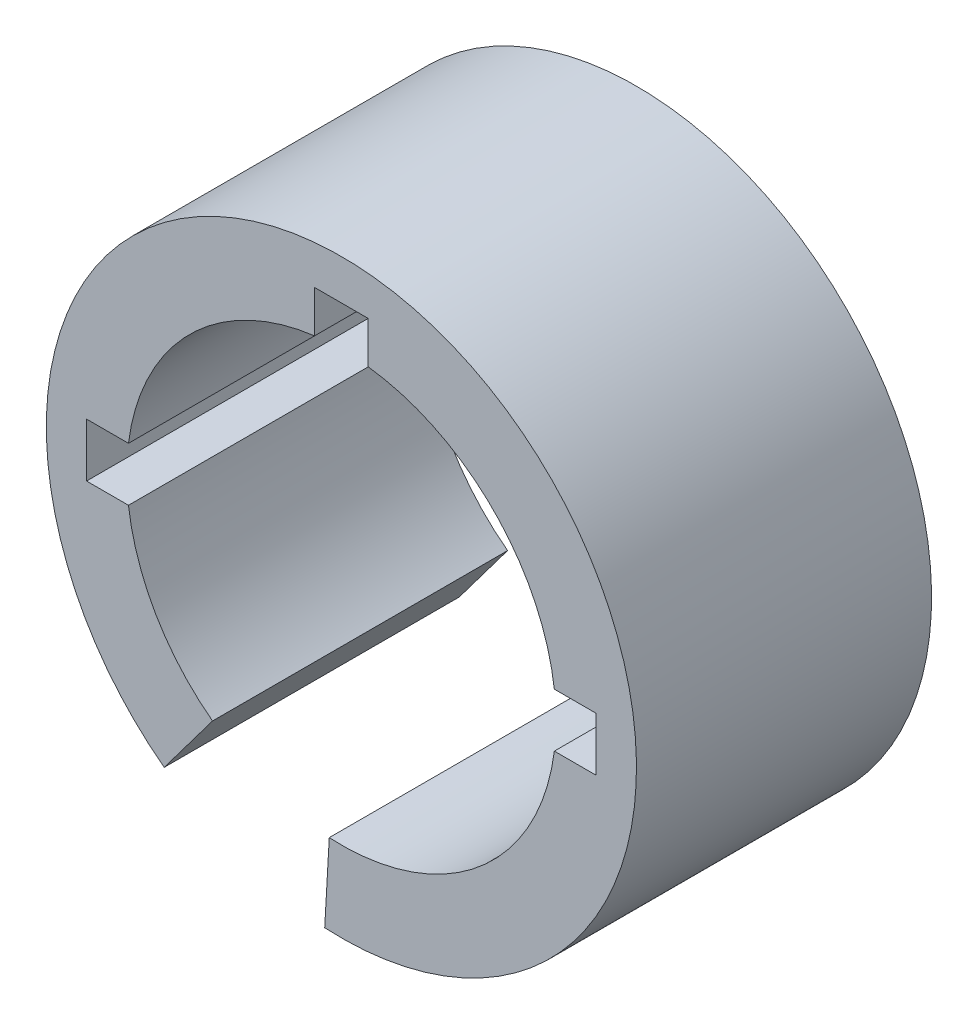
ISO-10303-21;
HEADER;
FILE_DESCRIPTION(('STEP AP214'),'2;1');
FILE_NAME('part.step','',(''),(''),'','','');
FILE_SCHEMA(('AUTOMOTIVE_DESIGN { 1 0 10303 214 1 1 1 1 }'));
ENDSEC;
DATA;
#1=APPLICATION_CONTEXT('core data for automotive mechanical design processes');
#2=APPLICATION_PROTOCOL_DEFINITION('international standard','automotive_design',2000,#1);
#3=PRODUCT_CONTEXT('',#1,'mechanical');
#4=PRODUCT('Part','Part','',(#3));
#5=PRODUCT_RELATED_PRODUCT_CATEGORY('part','',(#4));
#6=PRODUCT_DEFINITION_FORMATION('','',#4);
#7=PRODUCT_DEFINITION_CONTEXT('part definition',#1,'design');
#8=PRODUCT_DEFINITION('design','',#6,#7);
#9=PRODUCT_DEFINITION_SHAPE('','',#8);
#10=(LENGTH_UNIT() NAMED_UNIT(*) SI_UNIT(.MILLI.,.METRE.));
#11=(NAMED_UNIT(*) PLANE_ANGLE_UNIT() SI_UNIT($,.RADIAN.));
#12=(NAMED_UNIT(*) SI_UNIT($,.STERADIAN.) SOLID_ANGLE_UNIT());
#13=UNCERTAINTY_MEASURE_WITH_UNIT(LENGTH_MEASURE(1.E-05),#10,'distance_accuracy_value','');
#14=(GEOMETRIC_REPRESENTATION_CONTEXT(3) GLOBAL_UNCERTAINTY_ASSIGNED_CONTEXT((#13)) GLOBAL_UNIT_ASSIGNED_CONTEXT((#10,
#11,#12)) REPRESENTATION_CONTEXT('',''));
#15=CARTESIAN_POINT('',(0.,0.,0.));
#16=DIRECTION('',(0.,0.,1.));
#17=DIRECTION('',(1.,0.,0.));
#18=AXIS2_PLACEMENT_3D('',#15,#16,#17);
#19=CARTESIAN_POINT('',(0.,0.,5.5));
#20=DIRECTION('',(0.,0.,-1.));
#21=DIRECTION('',(-1.,0.,0.));
#22=AXIS2_PLACEMENT_3D('',#19,#20,#21);
#23=CYLINDRICAL_SURFACE('',#22,4.);
#24=CARTESIAN_POINT('',(0.,0.,0.));
#25=DIRECTION('',(0.,0.,1.));
#26=DIRECTION('',(1.,0.,0.));
#27=AXIS2_PLACEMENT_3D('',#24,#25,#26);
#28=CIRCLE('',#27,4.);
#29=CARTESIAN_POINT('',(-0.5,3.96862696659689,0.));
#30=VERTEX_POINT('',#29);
#31=CARTESIAN_POINT('',(-3.96862696659689,0.5,0.));
#32=VERTEX_POINT('',#31);
#33=EDGE_CURVE('E176',#30,#32,#28,.T.);
#34=ORIENTED_EDGE('',*,*,#33,.F.);
#35=DIRECTION('',(0.,0.,1.));
#36=VECTOR('',#35,1.);
#37=CARTESIAN_POINT('',(-0.5,3.96862696659689,0.));
#38=LINE('',#37,#36);
#39=CARTESIAN_POINT('',(-0.5,3.96862696659689,5.5));
#40=VERTEX_POINT('',#39);
#41=EDGE_CURVE('E228',#30,#40,#38,.T.);
#42=ORIENTED_EDGE('',*,*,#41,.T.);
#43=CARTESIAN_POINT('',(0.,0.,5.5));
#44=DIRECTION('',(0.,0.,1.));
#45=DIRECTION('',(1.,0.,0.));
#46=AXIS2_PLACEMENT_3D('',#43,#44,#45);
#47=CIRCLE('',#46,4.);
#48=CARTESIAN_POINT('',(-3.96862696659689,0.5,5.5));
#49=VERTEX_POINT('',#48);
#50=EDGE_CURVE('E222',#40,#49,#47,.T.);
#51=ORIENTED_EDGE('',*,*,#50,.T.);
#52=DIRECTION('',(0.,0.,1.));
#53=VECTOR('',#52,1.);
#54=CARTESIAN_POINT('',(-3.96862696659689,0.5,0.));
#55=LINE('',#54,#53);
#56=EDGE_CURVE('E259',#32,#49,#55,.T.);
#57=ORIENTED_EDGE('',*,*,#56,.F.);
#58=EDGE_LOOP('',(#34,#42,#51,#57));
#59=FACE_BOUND('',#58,.T.);
#60=ADVANCED_FACE('F37',(#59),#23,.F.);
#61=DIRECTION('',(0.,0.,1.));
#62=VECTOR('',#61,1.);
#63=CARTESIAN_POINT('',(0.5,3.96862696659689,0.));
#64=LINE('',#63,#62);
#65=CARTESIAN_POINT('',(0.5,3.96862696659689,0.));
#66=VERTEX_POINT('',#65);
#67=CARTESIAN_POINT('',(0.5,3.96862696659689,5.5));
#68=VERTEX_POINT('',#67);
#69=EDGE_CURVE('E152',#66,#68,#64,.T.);
#70=ORIENTED_EDGE('',*,*,#69,.F.);
#71=CARTESIAN_POINT('',(3.96862696659689,0.5,0.));
#72=VERTEX_POINT('',#71);
#73=EDGE_CURVE('E165',#72,#66,#28,.T.);
#74=ORIENTED_EDGE('',*,*,#73,.F.);
#75=DIRECTION('',(0.,0.,1.));
#76=VECTOR('',#75,1.);
#77=CARTESIAN_POINT('',(3.96862696659689,0.5,0.));
#78=LINE('',#77,#76);
#79=CARTESIAN_POINT('',(3.96862696659689,0.5,5.5));
#80=VERTEX_POINT('',#79);
#81=EDGE_CURVE('E282',#72,#80,#78,.T.);
#82=ORIENTED_EDGE('',*,*,#81,.T.);
#83=EDGE_CURVE('E167',#80,#68,#47,.T.);
#84=ORIENTED_EDGE('',*,*,#83,.T.);
#85=EDGE_LOOP('',(#70,#74,#82,#84));
#86=FACE_BOUND('',#85,.T.);
#87=ADVANCED_FACE('F163',(#86),#23,.F.);
#88=DIRECTION('',(0.,0.,1.));
#89=VECTOR('',#88,1.);
#90=CARTESIAN_POINT('',(-3.96862696659689,-0.5,0.));
#91=LINE('',#90,#89);
#92=CARTESIAN_POINT('',(-3.96862696659689,-0.5,0.));
#93=VERTEX_POINT('',#92);
#94=CARTESIAN_POINT('',(-3.96862696659689,-0.5,5.5));
#95=VERTEX_POINT('',#94);
#96=EDGE_CURVE('E60',#93,#95,#91,.T.);
#97=ORIENTED_EDGE('',*,*,#96,.T.);
#98=CARTESIAN_POINT('',(-2.40194493713915,-3.19854037319393,5.5));
#99=VERTEX_POINT('',#98);
#100=EDGE_CURVE('E214',#95,#99,#47,.T.);
#101=ORIENTED_EDGE('',*,*,#100,.T.);
#102=DIRECTION('',(0.,0.,-1.));
#103=VECTOR('',#102,1.);
#104=CARTESIAN_POINT('',(-2.40194493713915,-3.19854037319393,5.5));
#105=LINE('',#104,#103);
#106=CARTESIAN_POINT('',(-2.40194493713915,-3.19854037319393,0.));
#107=VERTEX_POINT('',#106);
#108=EDGE_CURVE('E188',#99,#107,#105,.T.);
#109=ORIENTED_EDGE('',*,*,#108,.T.);
#110=EDGE_CURVE('E180',#93,#107,#28,.T.);
#111=ORIENTED_EDGE('',*,*,#110,.F.);
#112=EDGE_LOOP('',(#97,#101,#109,#111));
#113=FACE_BOUND('',#112,.T.);
#114=ADVANCED_FACE('F212',(#113),#23,.F.);
#115=CARTESIAN_POINT('',(0.,0.,5.5));
#116=DIRECTION('',(0.,0.,1.));
#117=DIRECTION('',(1.,0.,0.));
#118=AXIS2_PLACEMENT_3D('',#115,#116,#117);
#119=PLANE('',#118);
#120=ORIENTED_EDGE('',*,*,#50,.F.);
#121=DIRECTION('',(0.,1.,0.));
#122=VECTOR('',#121,1.);
#123=CARTESIAN_POINT('',(-0.5,0.,5.5));
#124=LINE('',#123,#122);
#125=CARTESIAN_POINT('',(-0.5,4.75,5.5));
#126=VERTEX_POINT('',#125);
#127=EDGE_CURVE('E158',#40,#126,#124,.T.);
#128=ORIENTED_EDGE('',*,*,#127,.T.);
#129=DIRECTION('',(1.,0.,0.));
#130=VECTOR('',#129,1.);
#131=CARTESIAN_POINT('',(0.,4.75,5.5));
#132=LINE('',#131,#130);
#133=CARTESIAN_POINT('',(0.5,4.75,5.5));
#134=VERTEX_POINT('',#133);
#135=EDGE_CURVE('E354',#126,#134,#132,.T.);
#136=ORIENTED_EDGE('',*,*,#135,.T.);
#137=DIRECTION('',(0.,1.,0.));
#138=VECTOR('',#137,1.);
#139=CARTESIAN_POINT('',(0.5,0.,5.5));
#140=LINE('',#139,#138);
#141=EDGE_CURVE('E258',#68,#134,#140,.T.);
#142=ORIENTED_EDGE('',*,*,#141,.F.);
#143=ORIENTED_EDGE('',*,*,#83,.F.);
#144=DIRECTION('',(1.,0.,0.));
#145=VECTOR('',#144,1.);
#146=CARTESIAN_POINT('',(0.,0.5,5.5));
#147=LINE('',#146,#145);
#148=CARTESIAN_POINT('',(4.75,0.5,5.5));
#149=VERTEX_POINT('',#148);
#150=EDGE_CURVE('E274',#80,#149,#147,.T.);
#151=ORIENTED_EDGE('',*,*,#150,.T.);
#152=DIRECTION('',(0.,-1.,0.));
#153=VECTOR('',#152,1.);
#154=CARTESIAN_POINT('',(4.75,0.,5.5));
#155=LINE('',#154,#153);
#156=CARTESIAN_POINT('',(4.75,-0.5,5.5));
#157=VERTEX_POINT('',#156);
#158=EDGE_CURVE('E271',#149,#157,#155,.T.);
#159=ORIENTED_EDGE('',*,*,#158,.T.);
#160=DIRECTION('',(1.,0.,0.));
#161=VECTOR('',#160,1.);
#162=CARTESIAN_POINT('',(0.,-0.5,5.5));
#163=LINE('',#162,#161);
#164=CARTESIAN_POINT('',(3.96862696659689,-0.5,5.5));
#165=VERTEX_POINT('',#164);
#166=EDGE_CURVE('E265',#165,#157,#163,.T.);
#167=ORIENTED_EDGE('',*,*,#166,.F.);
#168=CARTESIAN_POINT('',(-0.226235298064918,-3.99359707405611,5.5));
#169=VERTEX_POINT('',#168);
#170=EDGE_CURVE('E189',#169,#165,#47,.T.);
#171=ORIENTED_EDGE('',*,*,#170,.F.);
#172=DIRECTION('',(-0.0565588245162294,-0.998399268514026,0.));
#173=VECTOR('',#172,1.);
#174=CARTESIAN_POINT('',(0.,0.,5.5));
#175=LINE('',#174,#173);
#176=CARTESIAN_POINT('',(-0.311073534839262,-5.49119597682714,5.5));
#177=VERTEX_POINT('',#176);
#178=EDGE_CURVE('E179',#169,#177,#175,.T.);
#179=ORIENTED_EDGE('',*,*,#178,.T.);
#180=CARTESIAN_POINT('',(0.,0.,5.5));
#181=DIRECTION('',(0.,0.,1.));
#182=DIRECTION('',(1.,0.,0.));
#183=AXIS2_PLACEMENT_3D('',#180,#181,#182);
#184=CIRCLE('',#183,5.5);
#185=CARTESIAN_POINT('',(-3.30267428856633,-4.39799301314166,5.5));
#186=VERTEX_POINT('',#185);
#187=EDGE_CURVE('E220',#177,#186,#184,.T.);
#188=ORIENTED_EDGE('',*,*,#187,.T.);
#189=DIRECTION('',(-0.600486234284788,-0.799635093298484,0.));
#190=VECTOR('',#189,1.);
#191=CARTESIAN_POINT('',(0.,0.,5.5));
#192=LINE('',#191,#190);
#193=EDGE_CURVE('E200',#99,#186,#192,.T.);
#194=ORIENTED_EDGE('',*,*,#193,.F.);
#195=ORIENTED_EDGE('',*,*,#100,.F.);
#196=DIRECTION('',(1.,0.,0.));
#197=VECTOR('',#196,1.);
#198=CARTESIAN_POINT('',(0.,-0.5,5.5));
#199=LINE('',#198,#197);
#200=CARTESIAN_POINT('',(-4.75,-0.5,5.5));
#201=VERTEX_POINT('',#200);
#202=EDGE_CURVE('E251',#201,#95,#199,.T.);
#203=ORIENTED_EDGE('',*,*,#202,.F.);
#204=DIRECTION('',(0.,-1.,0.));
#205=VECTOR('',#204,1.);
#206=CARTESIAN_POINT('',(-4.75,0.,5.5));
#207=LINE('',#206,#205);
#208=CARTESIAN_POINT('',(-4.75,0.5,5.5));
#209=VERTEX_POINT('',#208);
#210=EDGE_CURVE('E248',#209,#201,#207,.T.);
#211=ORIENTED_EDGE('',*,*,#210,.F.);
#212=DIRECTION('',(1.,0.,0.));
#213=VECTOR('',#212,1.);
#214=CARTESIAN_POINT('',(0.,0.5,5.5));
#215=LINE('',#214,#213);
#216=EDGE_CURVE('E243',#209,#49,#215,.T.);
#217=ORIENTED_EDGE('',*,*,#216,.T.);
#218=EDGE_LOOP('',(#120,#128,#136,#142,#143,#151,#159,#167,#171,#179,#188,#194,#195,#203,#211,#217));
#219=FACE_BOUND('',#218,.T.);
#220=ADVANCED_FACE('F217',(#219),#119,.T.);
#221=CARTESIAN_POINT('',(0.,0.,0.));
#222=DIRECTION('',(0.,0.,1.));
#223=DIRECTION('',(1.,0.,0.));
#224=AXIS2_PLACEMENT_3D('',#221,#222,#223);
#225=PLANE('',#224);
#226=DIRECTION('',(0.,1.,0.));
#227=VECTOR('',#226,1.);
#228=CARTESIAN_POINT('',(-0.5,0.,0.));
#229=LINE('',#228,#227);
#230=CARTESIAN_POINT('',(-0.5,4.75,0.));
#231=VERTEX_POINT('',#230);
#232=EDGE_CURVE('E168',#30,#231,#229,.T.);
#233=ORIENTED_EDGE('',*,*,#232,.F.);
#234=ORIENTED_EDGE('',*,*,#33,.T.);
#235=DIRECTION('',(1.,0.,0.));
#236=VECTOR('',#235,1.);
#237=CARTESIAN_POINT('',(0.,0.5,0.));
#238=LINE('',#237,#236);
#239=CARTESIAN_POINT('',(-4.75,0.5,0.));
#240=VERTEX_POINT('',#239);
#241=EDGE_CURVE('E245',#240,#32,#238,.T.);
#242=ORIENTED_EDGE('',*,*,#241,.F.);
#243=DIRECTION('',(0.,-1.,0.));
#244=VECTOR('',#243,1.);
#245=CARTESIAN_POINT('',(-4.75,0.,0.));
#246=LINE('',#245,#244);
#247=CARTESIAN_POINT('',(-4.75,-0.5,0.));
#248=VERTEX_POINT('',#247);
#249=EDGE_CURVE('E241',#240,#248,#246,.T.);
#250=ORIENTED_EDGE('',*,*,#249,.T.);
#251=DIRECTION('',(1.,0.,0.));
#252=VECTOR('',#251,1.);
#253=CARTESIAN_POINT('',(0.,-0.5,0.));
#254=LINE('',#253,#252);
#255=EDGE_CURVE('E210',#248,#93,#254,.T.);
#256=ORIENTED_EDGE('',*,*,#255,.T.);
#257=ORIENTED_EDGE('',*,*,#110,.T.);
#258=DIRECTION('',(-0.600486234284788,-0.799635093298484,0.));
#259=VECTOR('',#258,1.);
#260=CARTESIAN_POINT('',(0.,0.,0.));
#261=LINE('',#260,#259);
#262=CARTESIAN_POINT('',(-3.30267428856633,-4.39799301314166,0.));
#263=VERTEX_POINT('',#262);
#264=EDGE_CURVE('E184',#107,#263,#261,.T.);
#265=ORIENTED_EDGE('',*,*,#264,.T.);
#266=CARTESIAN_POINT('',(0.,0.,0.));
#267=DIRECTION('',(0.,0.,1.));
#268=DIRECTION('',(1.,0.,0.));
#269=AXIS2_PLACEMENT_3D('',#266,#267,#268);
#270=CIRCLE('',#269,5.5);
#271=CARTESIAN_POINT('',(-0.311073534839262,-5.49119597682714,0.));
#272=VERTEX_POINT('',#271);
#273=EDGE_CURVE('E202',#272,#263,#270,.T.);
#274=ORIENTED_EDGE('',*,*,#273,.F.);
#275=DIRECTION('',(-0.0565588245162294,-0.998399268514026,0.));
#276=VECTOR('',#275,1.);
#277=CARTESIAN_POINT('',(0.,0.,0.));
#278=LINE('',#277,#276);
#279=CARTESIAN_POINT('',(-0.226235298064918,-3.99359707405611,0.));
#280=VERTEX_POINT('',#279);
#281=EDGE_CURVE('E207',#280,#272,#278,.T.);
#282=ORIENTED_EDGE('',*,*,#281,.F.);
#283=CARTESIAN_POINT('',(3.96862696659689,-0.5,0.));
#284=VERTEX_POINT('',#283);
#285=EDGE_CURVE('E175',#280,#284,#28,.T.);
#286=ORIENTED_EDGE('',*,*,#285,.T.);
#287=DIRECTION('',(1.,0.,0.));
#288=VECTOR('',#287,1.);
#289=CARTESIAN_POINT('',(0.,-0.5,0.));
#290=LINE('',#289,#288);
#291=CARTESIAN_POINT('',(4.75,-0.5,0.));
#292=VERTEX_POINT('',#291);
#293=EDGE_CURVE('E267',#284,#292,#290,.T.);
#294=ORIENTED_EDGE('',*,*,#293,.T.);
#295=DIRECTION('',(0.,-1.,0.));
#296=VECTOR('',#295,1.);
#297=CARTESIAN_POINT('',(4.75,0.,0.));
#298=LINE('',#297,#296);
#299=CARTESIAN_POINT('',(4.75,0.5,0.));
#300=VERTEX_POINT('',#299);
#301=EDGE_CURVE('E263',#300,#292,#298,.T.);
#302=ORIENTED_EDGE('',*,*,#301,.F.);
#303=DIRECTION('',(1.,0.,0.));
#304=VECTOR('',#303,1.);
#305=CARTESIAN_POINT('',(0.,0.5,0.));
#306=LINE('',#305,#304);
#307=EDGE_CURVE('E174',#72,#300,#306,.T.);
#308=ORIENTED_EDGE('',*,*,#307,.F.);
#309=ORIENTED_EDGE('',*,*,#73,.T.);
#310=DIRECTION('',(0.,1.,0.));
#311=VECTOR('',#310,1.);
#312=CARTESIAN_POINT('',(0.5,0.,0.));
#313=LINE('',#312,#311);
#314=CARTESIAN_POINT('',(0.5,4.75,0.));
#315=VERTEX_POINT('',#314);
#316=EDGE_CURVE('E149',#66,#315,#313,.T.);
#317=ORIENTED_EDGE('',*,*,#316,.T.);
#318=DIRECTION('',(1.,0.,0.));
#319=VECTOR('',#318,1.);
#320=CARTESIAN_POINT('',(0.,4.75,0.));
#321=LINE('',#320,#319);
#322=EDGE_CURVE('E157',#231,#315,#321,.T.);
#323=ORIENTED_EDGE('',*,*,#322,.F.);
#324=EDGE_LOOP('',(#233,#234,#242,#250,#256,#257,#265,#274,#282,#286,#294,#302,#308,#309,#317,#323));
#325=FACE_BOUND('',#324,.T.);
#326=ADVANCED_FACE('F172',(#325),#225,.F.);
#327=CARTESIAN_POINT('',(0.,0.,5.5));
#328=DIRECTION('',(0.998399268514026,-0.0565588245162294,0.));
#329=DIRECTION('',(0.0565588245162294,0.998399268514026,0.));
#330=AXIS2_PLACEMENT_3D('',#327,#328,#329);
#331=PLANE('',#330);
#332=ORIENTED_EDGE('',*,*,#281,.T.);
#333=DIRECTION('',(0.,0.,-1.));
#334=VECTOR('',#333,1.);
#335=CARTESIAN_POINT('',(-0.311073534839262,-5.49119597682714,5.5));
#336=LINE('',#335,#334);
#337=EDGE_CURVE('E11',#177,#272,#336,.T.);
#338=ORIENTED_EDGE('',*,*,#337,.F.);
#339=ORIENTED_EDGE('',*,*,#178,.F.);
#340=DIRECTION('',(0.,0.,-1.));
#341=VECTOR('',#340,1.);
#342=CARTESIAN_POINT('',(-0.226235298064918,-3.99359707405611,5.5));
#343=LINE('',#342,#341);
#344=EDGE_CURVE('E186',#169,#280,#343,.T.);
#345=ORIENTED_EDGE('',*,*,#344,.T.);
#346=EDGE_LOOP('',(#332,#338,#339,#345));
#347=FACE_BOUND('',#346,.T.);
#348=ADVANCED_FACE('F39',(#347),#331,.F.);
#349=CARTESIAN_POINT('',(0.,0.,5.5));
#350=DIRECTION('',(0.,0.,-1.));
#351=DIRECTION('',(-1.,0.,0.));
#352=AXIS2_PLACEMENT_3D('',#349,#350,#351);
#353=CYLINDRICAL_SURFACE('',#352,5.5);
#354=ORIENTED_EDGE('',*,*,#273,.T.);
#355=DIRECTION('',(0.,0.,-1.));
#356=VECTOR('',#355,1.);
#357=CARTESIAN_POINT('',(-3.30267428856633,-4.39799301314166,5.5));
#358=LINE('',#357,#356);
#359=EDGE_CURVE('E45',#186,#263,#358,.T.);
#360=ORIENTED_EDGE('',*,*,#359,.F.);
#361=ORIENTED_EDGE('',*,*,#187,.F.);
#362=ORIENTED_EDGE('',*,*,#337,.T.);
#363=EDGE_LOOP('',(#354,#360,#361,#362));
#364=FACE_BOUND('',#363,.T.);
#365=ADVANCED_FACE('F203',(#364),#353,.T.);
#366=CARTESIAN_POINT('',(0.,0.,5.5));
#367=DIRECTION('',(0.799635093298484,-0.600486234284788,0.));
#368=DIRECTION('',(0.600486234284788,0.799635093298484,0.));
#369=AXIS2_PLACEMENT_3D('',#366,#367,#368);
#370=PLANE('',#369);
#371=ORIENTED_EDGE('',*,*,#264,.F.);
#372=ORIENTED_EDGE('',*,*,#108,.F.);
#373=ORIENTED_EDGE('',*,*,#193,.T.);
#374=ORIENTED_EDGE('',*,*,#359,.T.);
#375=EDGE_LOOP('',(#371,#372,#373,#374));
#376=FACE_BOUND('',#375,.T.);
#377=ADVANCED_FACE('F196',(#376),#370,.T.);
#378=DIRECTION('',(0.,0.,1.));
#379=VECTOR('',#378,1.);
#380=CARTESIAN_POINT('',(3.96862696659689,-0.5,0.));
#381=LINE('',#380,#379);
#382=EDGE_CURVE('E280',#284,#165,#381,.T.);
#383=ORIENTED_EDGE('',*,*,#382,.F.);
#384=ORIENTED_EDGE('',*,*,#285,.F.);
#385=ORIENTED_EDGE('',*,*,#344,.F.);
#386=ORIENTED_EDGE('',*,*,#170,.T.);
#387=EDGE_LOOP('',(#383,#384,#385,#386));
#388=FACE_BOUND('',#387,.T.);
#389=ADVANCED_FACE('F295',(#388),#23,.F.);
#390=CARTESIAN_POINT('',(4.75,0.,0.));
#391=DIRECTION('',(-1.,0.,0.));
#392=DIRECTION('',(0.,0.,1.));
#393=AXIS2_PLACEMENT_3D('',#390,#391,#392);
#394=PLANE('',#393);
#395=ORIENTED_EDGE('',*,*,#158,.F.);
#396=DIRECTION('',(0.,0.,1.));
#397=VECTOR('',#396,1.);
#398=CARTESIAN_POINT('',(4.75,0.5,0.));
#399=LINE('',#398,#397);
#400=EDGE_CURVE('E270',#300,#149,#399,.T.);
#401=ORIENTED_EDGE('',*,*,#400,.F.);
#402=ORIENTED_EDGE('',*,*,#301,.T.);
#403=DIRECTION('',(0.,0.,1.));
#404=VECTOR('',#403,1.);
#405=CARTESIAN_POINT('',(4.75,-0.5,0.));
#406=LINE('',#405,#404);
#407=EDGE_CURVE('E252',#292,#157,#406,.T.);
#408=ORIENTED_EDGE('',*,*,#407,.T.);
#409=EDGE_LOOP('',(#395,#401,#402,#408));
#410=FACE_BOUND('',#409,.T.);
#411=ADVANCED_FACE('F302',(#410),#394,.T.);
#412=CARTESIAN_POINT('',(0.,-0.5,0.));
#413=DIRECTION('',(0.,-1.,0.));
#414=DIRECTION('',(0.,0.,-1.));
#415=AXIS2_PLACEMENT_3D('',#412,#413,#414);
#416=PLANE('',#415);
#417=ORIENTED_EDGE('',*,*,#166,.T.);
#418=ORIENTED_EDGE('',*,*,#407,.F.);
#419=ORIENTED_EDGE('',*,*,#293,.F.);
#420=ORIENTED_EDGE('',*,*,#382,.T.);
#421=EDGE_LOOP('',(#417,#418,#419,#420));
#422=FACE_BOUND('',#421,.T.);
#423=ADVANCED_FACE('F308',(#422),#416,.F.);
#424=CARTESIAN_POINT('',(0.,0.5,0.));
#425=DIRECTION('',(0.,-1.,0.));
#426=DIRECTION('',(0.,0.,-1.));
#427=AXIS2_PLACEMENT_3D('',#424,#425,#426);
#428=PLANE('',#427);
#429=ORIENTED_EDGE('',*,*,#150,.F.);
#430=ORIENTED_EDGE('',*,*,#81,.F.);
#431=ORIENTED_EDGE('',*,*,#307,.T.);
#432=ORIENTED_EDGE('',*,*,#400,.T.);
#433=EDGE_LOOP('',(#429,#430,#431,#432));
#434=FACE_BOUND('',#433,.T.);
#435=ADVANCED_FACE('F321',(#434),#428,.T.);
#436=CARTESIAN_POINT('',(-4.75,0.,0.));
#437=DIRECTION('',(-1.,0.,0.));
#438=DIRECTION('',(0.,0.,1.));
#439=AXIS2_PLACEMENT_3D('',#436,#437,#438);
#440=PLANE('',#439);
#441=ORIENTED_EDGE('',*,*,#210,.T.);
#442=DIRECTION('',(0.,0.,1.));
#443=VECTOR('',#442,1.);
#444=CARTESIAN_POINT('',(-4.75,-0.5,0.));
#445=LINE('',#444,#443);
#446=EDGE_CURVE('E247',#248,#201,#445,.T.);
#447=ORIENTED_EDGE('',*,*,#446,.F.);
#448=ORIENTED_EDGE('',*,*,#249,.F.);
#449=DIRECTION('',(0.,0.,1.));
#450=VECTOR('',#449,1.);
#451=CARTESIAN_POINT('',(-4.75,0.5,0.));
#452=LINE('',#451,#450);
#453=EDGE_CURVE('E256',#240,#209,#452,.T.);
#454=ORIENTED_EDGE('',*,*,#453,.T.);
#455=EDGE_LOOP('',(#441,#447,#448,#454));
#456=FACE_BOUND('',#455,.T.);
#457=ADVANCED_FACE('F324',(#456),#440,.F.);
#458=CARTESIAN_POINT('',(0.,0.5,0.));
#459=DIRECTION('',(0.,-1.,0.));
#460=DIRECTION('',(0.,0.,-1.));
#461=AXIS2_PLACEMENT_3D('',#458,#459,#460);
#462=PLANE('',#461);
#463=ORIENTED_EDGE('',*,*,#216,.F.);
#464=ORIENTED_EDGE('',*,*,#453,.F.);
#465=ORIENTED_EDGE('',*,*,#241,.T.);
#466=ORIENTED_EDGE('',*,*,#56,.T.);
#467=EDGE_LOOP('',(#463,#464,#465,#466));
#468=FACE_BOUND('',#467,.T.);
#469=ADVANCED_FACE('F331',(#468),#462,.T.);
#470=CARTESIAN_POINT('',(0.,-0.5,0.));
#471=DIRECTION('',(0.,-1.,0.));
#472=DIRECTION('',(0.,0.,-1.));
#473=AXIS2_PLACEMENT_3D('',#470,#471,#472);
#474=PLANE('',#473);
#475=ORIENTED_EDGE('',*,*,#202,.T.);
#476=ORIENTED_EDGE('',*,*,#96,.F.);
#477=ORIENTED_EDGE('',*,*,#255,.F.);
#478=ORIENTED_EDGE('',*,*,#446,.T.);
#479=EDGE_LOOP('',(#475,#476,#477,#478));
#480=FACE_BOUND('',#479,.T.);
#481=ADVANCED_FACE('F333',(#480),#474,.F.);
#482=CARTESIAN_POINT('',(-0.5,0.,0.));
#483=DIRECTION('',(1.,0.,0.));
#484=DIRECTION('',(0.,1.,0.));
#485=AXIS2_PLACEMENT_3D('',#482,#483,#484);
#486=PLANE('',#485);
#487=ORIENTED_EDGE('',*,*,#127,.F.);
#488=ORIENTED_EDGE('',*,*,#41,.F.);
#489=ORIENTED_EDGE('',*,*,#232,.T.);
#490=DIRECTION('',(0.,0.,1.));
#491=VECTOR('',#490,1.);
#492=CARTESIAN_POINT('',(-0.5,4.75,0.));
#493=LINE('',#492,#491);
#494=EDGE_CURVE('E231',#231,#126,#493,.T.);
#495=ORIENTED_EDGE('',*,*,#494,.T.);
#496=EDGE_LOOP('',(#487,#488,#489,#495));
#497=FACE_BOUND('',#496,.T.);
#498=ADVANCED_FACE('F336',(#497),#486,.T.);
#499=CARTESIAN_POINT('',(0.,4.75,0.));
#500=DIRECTION('',(0.,-1.,0.));
#501=DIRECTION('',(1.,0.,0.));
#502=AXIS2_PLACEMENT_3D('',#499,#500,#501);
#503=PLANE('',#502);
#504=ORIENTED_EDGE('',*,*,#135,.F.);
#505=ORIENTED_EDGE('',*,*,#494,.F.);
#506=ORIENTED_EDGE('',*,*,#322,.T.);
#507=DIRECTION('',(0.,0.,1.));
#508=VECTOR('',#507,1.);
#509=CARTESIAN_POINT('',(0.5,4.75,0.));
#510=LINE('',#509,#508);
#511=EDGE_CURVE('E52',#315,#134,#510,.T.);
#512=ORIENTED_EDGE('',*,*,#511,.T.);
#513=EDGE_LOOP('',(#504,#505,#506,#512));
#514=FACE_BOUND('',#513,.T.);
#515=ADVANCED_FACE('F342',(#514),#503,.T.);
#516=CARTESIAN_POINT('',(0.5,0.,0.));
#517=DIRECTION('',(1.,0.,0.));
#518=DIRECTION('',(0.,1.,0.));
#519=AXIS2_PLACEMENT_3D('',#516,#517,#518);
#520=PLANE('',#519);
#521=ORIENTED_EDGE('',*,*,#141,.T.);
#522=ORIENTED_EDGE('',*,*,#511,.F.);
#523=ORIENTED_EDGE('',*,*,#316,.F.);
#524=ORIENTED_EDGE('',*,*,#69,.T.);
#525=EDGE_LOOP('',(#521,#522,#523,#524));
#526=FACE_BOUND('',#525,.T.);
#527=ADVANCED_FACE('F151',(#526),#520,.F.);
#528=CLOSED_SHELL('',(#60,#87,#114,#220,#326,#348,#365,#377,#389,#411,#423,#435,#457,#469,#481,
#498,#515,#527));
#529=MANIFOLD_SOLID_BREP('B2',#528);
#530=ADVANCED_BREP_SHAPE_REPRESENTATION('',(#18,#529),#14);
#531=SHAPE_DEFINITION_REPRESENTATION(#9,#530);
ENDSEC;
END-ISO-10303-21;
